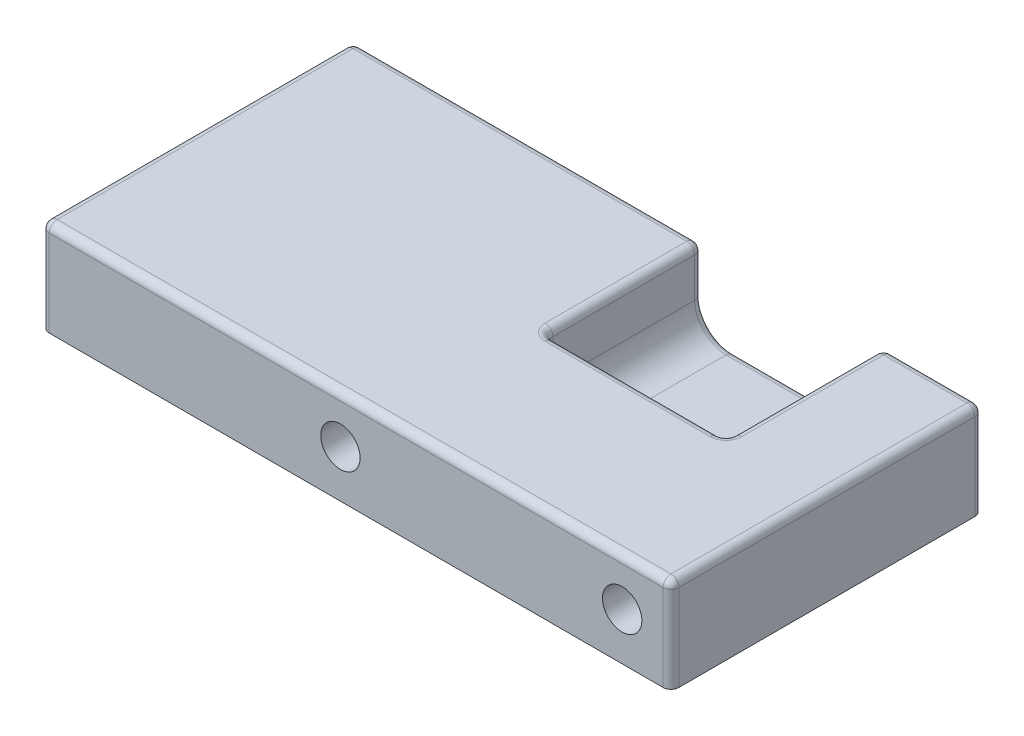
ISO-10303-21;
HEADER;
FILE_DESCRIPTION(('STEP AP214'),'2;1');
FILE_NAME('part.step','',(''),(''),'','','');
FILE_SCHEMA(('AUTOMOTIVE_DESIGN { 1 0 10303 214 1 1 1 1 }'));
ENDSEC;
DATA;
#1=APPLICATION_CONTEXT('core data for automotive mechanical design processes');
#2=APPLICATION_PROTOCOL_DEFINITION('international standard','automotive_design',2000,#1);
#3=PRODUCT_CONTEXT('',#1,'mechanical');
#4=PRODUCT('Part','Part','',(#3));
#5=PRODUCT_RELATED_PRODUCT_CATEGORY('part','',(#4));
#6=PRODUCT_DEFINITION_FORMATION('','',#4);
#7=PRODUCT_DEFINITION_CONTEXT('part definition',#1,'design');
#8=PRODUCT_DEFINITION('design','',#6,#7);
#9=PRODUCT_DEFINITION_SHAPE('','',#8);
#10=(LENGTH_UNIT() NAMED_UNIT(*) SI_UNIT(.MILLI.,.METRE.));
#11=(NAMED_UNIT(*) PLANE_ANGLE_UNIT() SI_UNIT($,.RADIAN.));
#12=(NAMED_UNIT(*) SI_UNIT($,.STERADIAN.) SOLID_ANGLE_UNIT());
#13=UNCERTAINTY_MEASURE_WITH_UNIT(LENGTH_MEASURE(1.E-05),#10,'distance_accuracy_value','');
#14=(GEOMETRIC_REPRESENTATION_CONTEXT(3) GLOBAL_UNCERTAINTY_ASSIGNED_CONTEXT((#13)) GLOBAL_UNIT_ASSIGNED_CONTEXT((#10,
#11,#12)) REPRESENTATION_CONTEXT('',''));
#15=CARTESIAN_POINT('',(0.,0.,0.));
#16=DIRECTION('',(0.,0.,1.));
#17=DIRECTION('',(1.,0.,0.));
#18=AXIS2_PLACEMENT_3D('',#15,#16,#17);
#19=CARTESIAN_POINT('',(0.,12.,0.));
#20=DIRECTION('',(1.,0.,0.));
#21=DIRECTION('',(0.,0.,-1.));
#22=AXIS2_PLACEMENT_3D('',#19,#20,#21);
#23=PLANE('',#22);
#24=DIRECTION('',(0.,0.,1.));
#25=VECTOR('',#24,1.);
#26=CARTESIAN_POINT('',(0.,0.,0.));
#27=LINE('',#26,#25);
#28=CARTESIAN_POINT('',(0.,0.,-38.6));
#29=VERTEX_POINT('',#28);
#30=CARTESIAN_POINT('',(0.,0.,-1.));
#31=VERTEX_POINT('',#30);
#32=EDGE_CURVE('E436',#29,#31,#27,.T.);
#33=ORIENTED_EDGE('',*,*,#32,.T.);
#34=DIRECTION('',(0.,-1.,0.));
#35=VECTOR('',#34,1.);
#36=CARTESIAN_POINT('',(0.,12.,-1.));
#37=LINE('',#36,#35);
#38=CARTESIAN_POINT('',(0.,11.,-1.));
#39=VERTEX_POINT('',#38);
#40=EDGE_CURVE('E11',#31,#39,#37,.F.);
#41=ORIENTED_EDGE('',*,*,#40,.T.);
#42=DIRECTION('',(0.,0.,1.));
#43=VECTOR('',#42,1.);
#44=CARTESIAN_POINT('',(0.,11.,0.));
#45=LINE('',#44,#43);
#46=CARTESIAN_POINT('',(0.,11.,-38.6));
#47=VERTEX_POINT('',#46);
#48=EDGE_CURVE('E48',#39,#47,#45,.F.);
#49=ORIENTED_EDGE('',*,*,#48,.T.);
#50=DIRECTION('',(0.,-1.,0.));
#51=VECTOR('',#50,1.);
#52=CARTESIAN_POINT('',(0.,12.,-38.6));
#53=LINE('',#52,#51);
#54=EDGE_CURVE('E41',#47,#29,#53,.T.);
#55=ORIENTED_EDGE('',*,*,#54,.T.);
#56=EDGE_LOOP('',(#33,#41,#49,#55));
#57=FACE_BOUND('',#56,.T.);
#58=ADVANCED_FACE('F32',(#57),#23,.F.);
#59=CARTESIAN_POINT('',(0.,12.,0.));
#60=DIRECTION('',(0.,0.,-1.));
#61=DIRECTION('',(-1.,0.,0.));
#62=AXIS2_PLACEMENT_3D('',#59,#60,#61);
#63=PLANE('',#62);
#64=DIRECTION('',(1.,0.,0.));
#65=VECTOR('',#64,1.);
#66=CARTESIAN_POINT('',(0.,0.,0.));
#67=LINE('',#66,#65);
#68=CARTESIAN_POINT('',(1.,0.,0.));
#69=VERTEX_POINT('',#68);
#70=CARTESIAN_POINT('',(79.,0.,0.));
#71=VERTEX_POINT('',#70);
#72=EDGE_CURVE('E438',#69,#71,#67,.T.);
#73=ORIENTED_EDGE('',*,*,#72,.T.);
#74=DIRECTION('',(0.,-1.,0.));
#75=VECTOR('',#74,1.);
#76=CARTESIAN_POINT('',(79.,12.,0.));
#77=LINE('',#76,#75);
#78=CARTESIAN_POINT('',(79.,11.,0.));
#79=VERTEX_POINT('',#78);
#80=EDGE_CURVE('E328',#71,#79,#77,.F.);
#81=ORIENTED_EDGE('',*,*,#80,.T.);
#82=DIRECTION('',(1.,0.,0.));
#83=VECTOR('',#82,1.);
#84=CARTESIAN_POINT('',(0.,11.,0.));
#85=LINE('',#84,#83);
#86=CARTESIAN_POINT('',(1.,11.,0.));
#87=VERTEX_POINT('',#86);
#88=EDGE_CURVE('E324',#79,#87,#85,.F.);
#89=ORIENTED_EDGE('',*,*,#88,.T.);
#90=DIRECTION('',(0.,-1.,0.));
#91=VECTOR('',#90,1.);
#92=CARTESIAN_POINT('',(1.,12.,0.));
#93=LINE('',#92,#91);
#94=EDGE_CURVE('E326',#87,#69,#93,.T.);
#95=ORIENTED_EDGE('',*,*,#94,.T.);
#96=EDGE_LOOP('',(#73,#81,#89,#95));
#97=FACE_BOUND('',#96,.T.);
#98=CARTESIAN_POINT('',(73.8,6.,0.));
#99=DIRECTION('',(0.,0.,-1.));
#100=DIRECTION('',(-1.,0.,0.));
#101=AXIS2_PLACEMENT_3D('',#98,#99,#100);
#102=CIRCLE('',#101,2.5);
#103=CARTESIAN_POINT('',(71.3,6.,0.));
#104=VERTEX_POINT('',#103);
#105=EDGE_CURVE('E427',#104,#104,#102,.F.);
#106=ORIENTED_EDGE('',*,*,#105,.F.);
#107=EDGE_LOOP('',(#106));
#108=FACE_BOUND('',#107,.T.);
#109=CARTESIAN_POINT('',(38.,6.,0.));
#110=DIRECTION('',(0.,0.,-1.));
#111=DIRECTION('',(-1.,0.,0.));
#112=AXIS2_PLACEMENT_3D('',#109,#110,#111);
#113=CIRCLE('',#112,2.5);
#114=CARTESIAN_POINT('',(35.5,6.,0.));
#115=VERTEX_POINT('',#114);
#116=EDGE_CURVE('E433',#115,#115,#113,.F.);
#117=ORIENTED_EDGE('',*,*,#116,.F.);
#118=EDGE_LOOP('',(#117));
#119=FACE_BOUND('',#118,.T.);
#120=ADVANCED_FACE('F526',(#97,#108,#119),#63,.F.);
#121=CARTESIAN_POINT('',(80.,12.,0.));
#122=DIRECTION('',(-1.,0.,0.));
#123=DIRECTION('',(0.,0.,1.));
#124=AXIS2_PLACEMENT_3D('',#121,#122,#123);
#125=PLANE('',#124);
#126=DIRECTION('',(0.,0.,-1.));
#127=VECTOR('',#126,1.);
#128=CARTESIAN_POINT('',(80.,0.,0.));
#129=LINE('',#128,#127);
#130=CARTESIAN_POINT('',(80.,0.,-1.));
#131=VERTEX_POINT('',#130);
#132=CARTESIAN_POINT('',(80.,0.,-38.6));
#133=VERTEX_POINT('',#132);
#134=EDGE_CURVE('E441',#131,#133,#129,.T.);
#135=ORIENTED_EDGE('',*,*,#134,.T.);
#136=DIRECTION('',(0.,-1.,0.));
#137=VECTOR('',#136,1.);
#138=CARTESIAN_POINT('',(80.,12.,-38.6));
#139=LINE('',#138,#137);
#140=CARTESIAN_POINT('',(80.,11.,-38.6));
#141=VERTEX_POINT('',#140);
#142=EDGE_CURVE('E322',#133,#141,#139,.F.);
#143=ORIENTED_EDGE('',*,*,#142,.T.);
#144=DIRECTION('',(0.,0.,-1.));
#145=VECTOR('',#144,1.);
#146=CARTESIAN_POINT('',(80.,11.,0.));
#147=LINE('',#146,#145);
#148=CARTESIAN_POINT('',(80.,11.,-1.));
#149=VERTEX_POINT('',#148);
#150=EDGE_CURVE('E318',#141,#149,#147,.F.);
#151=ORIENTED_EDGE('',*,*,#150,.T.);
#152=DIRECTION('',(0.,-1.,0.));
#153=VECTOR('',#152,1.);
#154=CARTESIAN_POINT('',(80.,12.,-1.));
#155=LINE('',#154,#153);
#156=EDGE_CURVE('E320',#149,#131,#155,.T.);
#157=ORIENTED_EDGE('',*,*,#156,.T.);
#158=EDGE_LOOP('',(#135,#143,#151,#157));
#159=FACE_BOUND('',#158,.T.);
#160=ADVANCED_FACE('F511',(#159),#125,.F.);
#161=CARTESIAN_POINT('',(0.,12.,-39.6));
#162=DIRECTION('',(0.,0.,1.));
#163=DIRECTION('',(1.,0.,0.));
#164=AXIS2_PLACEMENT_3D('',#161,#162,#163);
#165=PLANE('',#164);
#166=DIRECTION('',(-1.,0.,0.));
#167=VECTOR('',#166,1.);
#168=CARTESIAN_POINT('',(0.,0.,-39.6));
#169=LINE('',#168,#167);
#170=CARTESIAN_POINT('',(79.,0.,-39.6));
#171=VERTEX_POINT('',#170);
#172=CARTESIAN_POINT('',(1.,0.,-39.6));
#173=VERTEX_POINT('',#172);
#174=EDGE_CURVE('E444',#171,#173,#169,.T.);
#175=ORIENTED_EDGE('',*,*,#174,.T.);
#176=DIRECTION('',(0.,-1.,0.));
#177=VECTOR('',#176,1.);
#178=CARTESIAN_POINT('',(1.,12.,-39.6));
#179=LINE('',#178,#177);
#180=CARTESIAN_POINT('',(1.,11.,-39.6));
#181=VERTEX_POINT('',#180);
#182=EDGE_CURVE('E302',#173,#181,#179,.F.);
#183=ORIENTED_EDGE('',*,*,#182,.T.);
#184=DIRECTION('',(-1.,0.,0.));
#185=VECTOR('',#184,1.);
#186=CARTESIAN_POINT('',(0.,11.,-39.6));
#187=LINE('',#186,#185);
#188=CARTESIAN_POINT('',(43.4,11.,-39.6));
#189=VERTEX_POINT('',#188);
#190=EDGE_CURVE('E300',#181,#189,#187,.F.);
#191=ORIENTED_EDGE('',*,*,#190,.T.);
#192=DIRECTION('',(0.,1.,0.));
#193=VECTOR('',#192,1.);
#194=CARTESIAN_POINT('',(43.4,12.,-39.6));
#195=LINE('',#194,#193);
#196=CARTESIAN_POINT('',(43.4,6.,-39.6));
#197=VERTEX_POINT('',#196);
#198=EDGE_CURVE('E298',#189,#197,#195,.F.);
#199=ORIENTED_EDGE('',*,*,#198,.T.);
#200=CARTESIAN_POINT('',(48.4,6.,-39.6));
#201=DIRECTION('',(0.,0.,1.));
#202=DIRECTION('',(1.,0.,0.));
#203=AXIS2_PLACEMENT_3D('',#200,#201,#202);
#204=CIRCLE('',#203,5.00000000000001);
#205=CARTESIAN_POINT('',(48.4,0.999999999999996,-39.6));
#206=VERTEX_POINT('',#205);
#207=EDGE_CURVE('E296',#197,#206,#204,.T.);
#208=ORIENTED_EDGE('',*,*,#207,.T.);
#209=DIRECTION('',(-1.,0.,0.));
#210=VECTOR('',#209,1.);
#211=CARTESIAN_POINT('',(0.,1.,-39.6));
#212=LINE('',#211,#210);
#213=CARTESIAN_POINT('',(63.4,0.999999999999995,-39.6));
#214=VERTEX_POINT('',#213);
#215=EDGE_CURVE('E294',#206,#214,#212,.F.);
#216=ORIENTED_EDGE('',*,*,#215,.T.);
#217=CARTESIAN_POINT('',(63.4,6.,-39.6));
#218=DIRECTION('',(0.,0.,1.));
#219=DIRECTION('',(1.,0.,0.));
#220=AXIS2_PLACEMENT_3D('',#217,#218,#219);
#221=CIRCLE('',#220,5.00000000000001);
#222=CARTESIAN_POINT('',(68.4,6.,-39.6));
#223=VERTEX_POINT('',#222);
#224=EDGE_CURVE('E292',#214,#223,#221,.T.);
#225=ORIENTED_EDGE('',*,*,#224,.T.);
#226=DIRECTION('',(0.,-1.,0.));
#227=VECTOR('',#226,1.);
#228=CARTESIAN_POINT('',(68.4,12.,-39.6));
#229=LINE('',#228,#227);
#230=CARTESIAN_POINT('',(68.4,11.,-39.6));
#231=VERTEX_POINT('',#230);
#232=EDGE_CURVE('E289',#223,#231,#229,.F.);
#233=ORIENTED_EDGE('',*,*,#232,.T.);
#234=DIRECTION('',(-1.,0.,0.));
#235=VECTOR('',#234,1.);
#236=CARTESIAN_POINT('',(0.,11.,-39.6));
#237=LINE('',#236,#235);
#238=CARTESIAN_POINT('',(79.,11.,-39.6));
#239=VERTEX_POINT('',#238);
#240=EDGE_CURVE('E285',#231,#239,#237,.F.);
#241=ORIENTED_EDGE('',*,*,#240,.T.);
#242=DIRECTION('',(0.,-1.,0.));
#243=VECTOR('',#242,1.);
#244=CARTESIAN_POINT('',(79.,12.,-39.6));
#245=LINE('',#244,#243);
#246=EDGE_CURVE('E287',#239,#171,#245,.T.);
#247=ORIENTED_EDGE('',*,*,#246,.T.);
#248=EDGE_LOOP('',(#175,#183,#191,#199,#208,#216,#225,#233,#241,#247));
#249=FACE_BOUND('',#248,.T.);
#250=CARTESIAN_POINT('',(73.8,6.,-39.6));
#251=DIRECTION('',(0.,0.,-1.));
#252=DIRECTION('',(-1.,0.,0.));
#253=AXIS2_PLACEMENT_3D('',#250,#251,#252);
#254=CIRCLE('',#253,2.5);
#255=CARTESIAN_POINT('',(71.3,6.,-39.6));
#256=VERTEX_POINT('',#255);
#257=EDGE_CURVE('E221',#256,#256,#254,.T.);
#258=ORIENTED_EDGE('',*,*,#257,.F.);
#259=EDGE_LOOP('',(#258));
#260=FACE_BOUND('',#259,.T.);
#261=CARTESIAN_POINT('',(38.,6.,-39.6));
#262=DIRECTION('',(0.,0.,-1.));
#263=DIRECTION('',(-1.,0.,0.));
#264=AXIS2_PLACEMENT_3D('',#261,#262,#263);
#265=CIRCLE('',#264,2.5);
#266=CARTESIAN_POINT('',(35.5,6.,-39.6));
#267=VERTEX_POINT('',#266);
#268=EDGE_CURVE('E430',#267,#267,#265,.T.);
#269=ORIENTED_EDGE('',*,*,#268,.F.);
#270=EDGE_LOOP('',(#269));
#271=FACE_BOUND('',#270,.T.);
#272=ADVANCED_FACE('F449',(#249,#260,#271),#165,.F.);
#273=CARTESIAN_POINT('',(0.,12.,0.));
#274=DIRECTION('',(0.,-1.,0.));
#275=DIRECTION('',(0.,0.,-1.));
#276=AXIS2_PLACEMENT_3D('',#273,#274,#275);
#277=PLANE('',#276);
#278=DIRECTION('',(0.,0.,1.));
#279=VECTOR('',#278,1.);
#280=CARTESIAN_POINT('',(1.,12.,0.));
#281=LINE('',#280,#279);
#282=CARTESIAN_POINT('',(1.,12.,-38.6));
#283=VERTEX_POINT('',#282);
#284=CARTESIAN_POINT('',(1.,12.,-1.));
#285=VERTEX_POINT('',#284);
#286=EDGE_CURVE('E260',#283,#285,#281,.T.);
#287=ORIENTED_EDGE('',*,*,#286,.T.);
#288=DIRECTION('',(1.,0.,0.));
#289=VECTOR('',#288,1.);
#290=CARTESIAN_POINT('',(0.,12.,-1.));
#291=LINE('',#290,#289);
#292=CARTESIAN_POINT('',(79.,12.,-1.));
#293=VERTEX_POINT('',#292);
#294=EDGE_CURVE('E264',#285,#293,#291,.T.);
#295=ORIENTED_EDGE('',*,*,#294,.T.);
#296=DIRECTION('',(0.,0.,-1.));
#297=VECTOR('',#296,1.);
#298=CARTESIAN_POINT('',(79.,12.,0.));
#299=LINE('',#298,#297);
#300=CARTESIAN_POINT('',(79.,12.,-38.6));
#301=VERTEX_POINT('',#300);
#302=EDGE_CURVE('E262',#293,#301,#299,.T.);
#303=ORIENTED_EDGE('',*,*,#302,.T.);
#304=DIRECTION('',(-1.,0.,0.));
#305=VECTOR('',#304,1.);
#306=CARTESIAN_POINT('',(0.,12.,-38.6));
#307=LINE('',#306,#305);
#308=CARTESIAN_POINT('',(68.4,12.,-38.6));
#309=VERTEX_POINT('',#308);
#310=EDGE_CURVE('E256',#301,#309,#307,.T.);
#311=ORIENTED_EDGE('',*,*,#310,.T.);
#312=DIRECTION('',(0.,0.,-1.));
#313=VECTOR('',#312,1.);
#314=CARTESIAN_POINT('',(68.4,12.,0.));
#315=LINE('',#314,#313);
#316=CARTESIAN_POINT('',(68.4,12.,-20.6));
#317=VERTEX_POINT('',#316);
#318=EDGE_CURVE('E253',#309,#317,#315,.F.);
#319=ORIENTED_EDGE('',*,*,#318,.T.);
#320=CARTESIAN_POINT('',(66.4,12.,-20.6));
#321=DIRECTION('',(0.,-1.,0.));
#322=DIRECTION('',(0.,0.,-1.));
#323=AXIS2_PLACEMENT_3D('',#320,#321,#322);
#324=CIRCLE('',#323,2.);
#325=CARTESIAN_POINT('',(66.4,12.,-18.6));
#326=VERTEX_POINT('',#325);
#327=EDGE_CURVE('E250',#326,#317,#324,.F.);
#328=ORIENTED_EDGE('',*,*,#327,.F.);
#329=DIRECTION('',(1.,0.,0.));
#330=VECTOR('',#329,1.);
#331=CARTESIAN_POINT('',(44.4,12.,-18.6));
#332=LINE('',#331,#330);
#333=CARTESIAN_POINT('',(45.4,12.,-18.6));
#334=VERTEX_POINT('',#333);
#335=EDGE_CURVE('E242',#326,#334,#332,.F.);
#336=ORIENTED_EDGE('',*,*,#335,.T.);
#337=CARTESIAN_POINT('',(45.4,12.,-20.6));
#338=DIRECTION('',(0.,-1.,0.));
#339=DIRECTION('',(0.,0.,-1.));
#340=AXIS2_PLACEMENT_3D('',#337,#338,#339);
#341=CIRCLE('',#340,2.);
#342=CARTESIAN_POINT('',(43.4,12.,-20.6));
#343=VERTEX_POINT('',#342);
#344=EDGE_CURVE('E238',#343,#334,#341,.F.);
#345=ORIENTED_EDGE('',*,*,#344,.F.);
#346=DIRECTION('',(0.,0.,-1.));
#347=VECTOR('',#346,1.);
#348=CARTESIAN_POINT('',(43.4,12.,0.));
#349=LINE('',#348,#347);
#350=CARTESIAN_POINT('',(43.4,12.,-38.6));
#351=VERTEX_POINT('',#350);
#352=EDGE_CURVE('E248',#343,#351,#349,.T.);
#353=ORIENTED_EDGE('',*,*,#352,.T.);
#354=DIRECTION('',(-1.,0.,0.));
#355=VECTOR('',#354,1.);
#356=CARTESIAN_POINT('',(0.,12.,-38.6));
#357=LINE('',#356,#355);
#358=EDGE_CURVE('E258',#351,#283,#357,.T.);
#359=ORIENTED_EDGE('',*,*,#358,.T.);
#360=EDGE_LOOP('',(#287,#295,#303,#311,#319,#328,#336,#345,#353,#359));
#361=FACE_BOUND('',#360,.T.);
#362=ADVANCED_FACE('F501',(#361),#277,.F.);
#363=CARTESIAN_POINT('',(0.,0.,0.));
#364=DIRECTION('',(0.,-1.,0.));
#365=DIRECTION('',(0.,0.,-1.));
#366=AXIS2_PLACEMENT_3D('',#363,#364,#365);
#367=PLANE('',#366);
#368=ORIENTED_EDGE('',*,*,#174,.F.);
#369=CARTESIAN_POINT('',(79.,0.,-38.6));
#370=DIRECTION('',(0.,-1.,0.));
#371=DIRECTION('',(0.,0.,-1.));
#372=AXIS2_PLACEMENT_3D('',#369,#370,#371);
#373=CIRCLE('',#372,1.);
#374=EDGE_CURVE('E316',#171,#133,#373,.T.);
#375=ORIENTED_EDGE('',*,*,#374,.T.);
#376=ORIENTED_EDGE('',*,*,#134,.F.);
#377=CARTESIAN_POINT('',(79.,0.,-1.));
#378=DIRECTION('',(0.,-1.,0.));
#379=DIRECTION('',(0.,0.,-1.));
#380=AXIS2_PLACEMENT_3D('',#377,#378,#379);
#381=CIRCLE('',#380,1.);
#382=EDGE_CURVE('E314',#131,#71,#381,.T.);
#383=ORIENTED_EDGE('',*,*,#382,.T.);
#384=ORIENTED_EDGE('',*,*,#72,.F.);
#385=CARTESIAN_POINT('',(1.,0.,-1.));
#386=DIRECTION('',(0.,-1.,0.));
#387=DIRECTION('',(0.,0.,-1.));
#388=AXIS2_PLACEMENT_3D('',#385,#386,#387);
#389=CIRCLE('',#388,1.);
#390=EDGE_CURVE('E312',#69,#31,#389,.T.);
#391=ORIENTED_EDGE('',*,*,#390,.T.);
#392=ORIENTED_EDGE('',*,*,#32,.F.);
#393=CARTESIAN_POINT('',(1.,0.,-38.6));
#394=DIRECTION('',(0.,-1.,0.));
#395=DIRECTION('',(0.,0.,-1.));
#396=AXIS2_PLACEMENT_3D('',#393,#394,#395);
#397=CIRCLE('',#396,1.);
#398=EDGE_CURVE('E310',#29,#173,#397,.T.);
#399=ORIENTED_EDGE('',*,*,#398,.T.);
#400=EDGE_LOOP('',(#368,#375,#376,#383,#384,#391,#392,#399));
#401=FACE_BOUND('',#400,.T.);
#402=ADVANCED_FACE('F604',(#401),#367,.T.);
#403=CARTESIAN_POINT('',(38.,6.,0.001000000000001));
#404=DIRECTION('',(0.,0.,-1.));
#405=DIRECTION('',(-1.,0.,0.));
#406=AXIS2_PLACEMENT_3D('',#403,#404,#405);
#407=CYLINDRICAL_SURFACE('',#406,2.5);
#408=ORIENTED_EDGE('',*,*,#268,.T.);
#409=EDGE_LOOP('',(#408));
#410=FACE_BOUND('',#409,.T.);
#411=ORIENTED_EDGE('',*,*,#116,.T.);
#412=EDGE_LOOP('',(#411));
#413=FACE_BOUND('',#412,.T.);
#414=ADVANCED_FACE('F607',(#410,#413),#407,.F.);
#415=CARTESIAN_POINT('',(73.8,6.,0.001000000000001));
#416=DIRECTION('',(0.,0.,-1.));
#417=DIRECTION('',(-1.,0.,0.));
#418=AXIS2_PLACEMENT_3D('',#415,#416,#417);
#419=CYLINDRICAL_SURFACE('',#418,2.5);
#420=ORIENTED_EDGE('',*,*,#257,.T.);
#421=EDGE_LOOP('',(#420));
#422=FACE_BOUND('',#421,.T.);
#423=ORIENTED_EDGE('',*,*,#105,.T.);
#424=EDGE_LOOP('',(#423));
#425=FACE_BOUND('',#424,.T.);
#426=ADVANCED_FACE('F612',(#422,#425),#419,.F.);
#427=CARTESIAN_POINT('',(63.4,6.,-19.6));
#428=DIRECTION('',(0.,0.,-1.));
#429=DIRECTION('',(-1.,0.,0.));
#430=AXIS2_PLACEMENT_3D('',#427,#428,#429);
#431=CYLINDRICAL_SURFACE('',#430,4.00000000000001);
#432=DIRECTION('',(0.,0.,-1.));
#433=VECTOR('',#432,1.);
#434=CARTESIAN_POINT('',(63.4,1.99999999999999,-19.6));
#435=LINE('',#434,#433);
#436=CARTESIAN_POINT('',(63.4,1.99999999999999,-20.6));
#437=VERTEX_POINT('',#436);
#438=CARTESIAN_POINT('',(63.4,1.99999999999999,-38.6));
#439=VERTEX_POINT('',#438);
#440=EDGE_CURVE('E205',#437,#439,#435,.T.);
#441=ORIENTED_EDGE('',*,*,#440,.F.);
#442=CARTESIAN_POINT('',(63.4,6.,-20.6));
#443=DIRECTION('',(0.,0.,-1.));
#444=DIRECTION('',(-1.,0.,0.));
#445=AXIS2_PLACEMENT_3D('',#442,#443,#444);
#446=CIRCLE('',#445,4.00000000000001);
#447=CARTESIAN_POINT('',(67.4,6.,-20.6));
#448=VERTEX_POINT('',#447);
#449=EDGE_CURVE('E199',#437,#448,#446,.F.);
#450=ORIENTED_EDGE('',*,*,#449,.T.);
#451=DIRECTION('',(0.,0.,-1.));
#452=VECTOR('',#451,1.);
#453=CARTESIAN_POINT('',(67.4,6.,-19.6));
#454=LINE('',#453,#452);
#455=CARTESIAN_POINT('',(67.4,6.,-38.6));
#456=VERTEX_POINT('',#455);
#457=EDGE_CURVE('E202',#448,#456,#454,.T.);
#458=ORIENTED_EDGE('',*,*,#457,.T.);
#459=CARTESIAN_POINT('',(63.4,6.,-38.6));
#460=DIRECTION('',(0.,0.,1.));
#461=DIRECTION('',(1.,0.,0.));
#462=AXIS2_PLACEMENT_3D('',#459,#460,#461);
#463=CIRCLE('',#462,4.00000000000001);
#464=EDGE_CURVE('E211',#456,#439,#463,.F.);
#465=ORIENTED_EDGE('',*,*,#464,.T.);
#466=EDGE_LOOP('',(#441,#450,#458,#465));
#467=FACE_BOUND('',#466,.T.);
#468=ADVANCED_FACE('F201',(#467),#431,.F.);
#469=CARTESIAN_POINT('',(67.4,6.,-19.6));
#470=DIRECTION('',(1.,0.,0.));
#471=DIRECTION('',(0.,0.,-1.));
#472=AXIS2_PLACEMENT_3D('',#469,#470,#471);
#473=PLANE('',#472);
#474=ORIENTED_EDGE('',*,*,#457,.F.);
#475=DIRECTION('',(0.,-1.,0.));
#476=VECTOR('',#475,1.);
#477=CARTESIAN_POINT('',(67.4,6.,-20.6));
#478=LINE('',#477,#476);
#479=CARTESIAN_POINT('',(67.4,11.,-20.6));
#480=VERTEX_POINT('',#479);
#481=EDGE_CURVE('E217',#448,#480,#478,.F.);
#482=ORIENTED_EDGE('',*,*,#481,.T.);
#483=DIRECTION('',(0.,0.,-1.));
#484=VECTOR('',#483,1.);
#485=CARTESIAN_POINT('',(67.4,11.,-19.6));
#486=LINE('',#485,#484);
#487=CARTESIAN_POINT('',(67.4,11.,-38.6));
#488=VERTEX_POINT('',#487);
#489=EDGE_CURVE('E239',#480,#488,#486,.T.);
#490=ORIENTED_EDGE('',*,*,#489,.T.);
#491=DIRECTION('',(0.,-1.,0.));
#492=VECTOR('',#491,1.);
#493=CARTESIAN_POINT('',(67.4,6.,-38.6));
#494=LINE('',#493,#492);
#495=EDGE_CURVE('E220',#488,#456,#494,.T.);
#496=ORIENTED_EDGE('',*,*,#495,.T.);
#497=EDGE_LOOP('',(#474,#482,#490,#496));
#498=FACE_BOUND('',#497,.T.);
#499=ADVANCED_FACE('F214',(#498),#473,.F.);
#500=CARTESIAN_POINT('',(44.4,6.,-19.6));
#501=DIRECTION('',(-1.,0.,0.));
#502=DIRECTION('',(0.,-1.,0.));
#503=AXIS2_PLACEMENT_3D('',#500,#501,#502);
#504=PLANE('',#503);
#505=DIRECTION('',(0.,0.,-1.));
#506=VECTOR('',#505,1.);
#507=CARTESIAN_POINT('',(44.4,11.,-19.6));
#508=LINE('',#507,#506);
#509=CARTESIAN_POINT('',(44.4,11.,-38.6));
#510=VERTEX_POINT('',#509);
#511=CARTESIAN_POINT('',(44.4,11.,-20.6));
#512=VERTEX_POINT('',#511);
#513=EDGE_CURVE('E306',#510,#512,#508,.F.);
#514=ORIENTED_EDGE('',*,*,#513,.T.);
#515=DIRECTION('',(0.,1.,0.));
#516=VECTOR('',#515,1.);
#517=CARTESIAN_POINT('',(44.4,6.,-20.6));
#518=LINE('',#517,#516);
#519=CARTESIAN_POINT('',(44.4,6.,-20.6));
#520=VERTEX_POINT('',#519);
#521=EDGE_CURVE('E308',#512,#520,#518,.F.);
#522=ORIENTED_EDGE('',*,*,#521,.T.);
#523=DIRECTION('',(0.,0.,-1.));
#524=VECTOR('',#523,1.);
#525=CARTESIAN_POINT('',(44.4,6.,-19.6));
#526=LINE('',#525,#524);
#527=CARTESIAN_POINT('',(44.4,6.,-38.6));
#528=VERTEX_POINT('',#527);
#529=EDGE_CURVE('E222',#520,#528,#526,.T.);
#530=ORIENTED_EDGE('',*,*,#529,.T.);
#531=DIRECTION('',(0.,1.,0.));
#532=VECTOR('',#531,1.);
#533=CARTESIAN_POINT('',(44.4,6.,-38.6));
#534=LINE('',#533,#532);
#535=EDGE_CURVE('E304',#528,#510,#534,.T.);
#536=ORIENTED_EDGE('',*,*,#535,.T.);
#537=EDGE_LOOP('',(#514,#522,#530,#536));
#538=FACE_BOUND('',#537,.T.);
#539=ADVANCED_FACE('F548',(#538),#504,.F.);
#540=CARTESIAN_POINT('',(48.4,6.,-19.6));
#541=DIRECTION('',(0.,0.,-1.));
#542=DIRECTION('',(-1.,0.,0.));
#543=AXIS2_PLACEMENT_3D('',#540,#541,#542);
#544=CYLINDRICAL_SURFACE('',#543,4.00000000000001);
#545=ORIENTED_EDGE('',*,*,#529,.F.);
#546=CARTESIAN_POINT('',(48.4,6.,-20.6));
#547=DIRECTION('',(0.,0.,-1.));
#548=DIRECTION('',(-1.,0.,0.));
#549=AXIS2_PLACEMENT_3D('',#546,#547,#548);
#550=CIRCLE('',#549,4.00000000000001);
#551=CARTESIAN_POINT('',(48.4,2.,-20.6));
#552=VERTEX_POINT('',#551);
#553=EDGE_CURVE('E283',#520,#552,#550,.F.);
#554=ORIENTED_EDGE('',*,*,#553,.T.);
#555=DIRECTION('',(0.,0.,-1.));
#556=VECTOR('',#555,1.);
#557=CARTESIAN_POINT('',(48.4,2.,-19.6));
#558=LINE('',#557,#556);
#559=CARTESIAN_POINT('',(48.4,2.,-38.6));
#560=VERTEX_POINT('',#559);
#561=EDGE_CURVE('E417',#552,#560,#558,.T.);
#562=ORIENTED_EDGE('',*,*,#561,.T.);
#563=CARTESIAN_POINT('',(48.4,6.,-38.6));
#564=DIRECTION('',(0.,0.,1.));
#565=DIRECTION('',(1.,0.,0.));
#566=AXIS2_PLACEMENT_3D('',#563,#564,#565);
#567=CIRCLE('',#566,4.00000000000001);
#568=EDGE_CURVE('E281',#560,#528,#567,.F.);
#569=ORIENTED_EDGE('',*,*,#568,.T.);
#570=EDGE_LOOP('',(#545,#554,#562,#569));
#571=FACE_BOUND('',#570,.T.);
#572=ADVANCED_FACE('F565',(#571),#544,.F.);
#573=CARTESIAN_POINT('',(63.4,1.99999999999999,-19.6));
#574=DIRECTION('',(0.,-1.,0.));
#575=DIRECTION('',(1.,0.,0.));
#576=AXIS2_PLACEMENT_3D('',#573,#574,#575);
#577=PLANE('',#576);
#578=ORIENTED_EDGE('',*,*,#561,.F.);
#579=DIRECTION('',(-1.,0.,0.));
#580=VECTOR('',#579,1.);
#581=CARTESIAN_POINT('',(63.4,1.99999999999999,-20.6));
#582=LINE('',#581,#580);
#583=EDGE_CURVE('E279',#552,#437,#582,.F.);
#584=ORIENTED_EDGE('',*,*,#583,.T.);
#585=ORIENTED_EDGE('',*,*,#440,.T.);
#586=DIRECTION('',(-1.,0.,0.));
#587=VECTOR('',#586,1.);
#588=CARTESIAN_POINT('',(63.4,1.99999999999999,-38.6));
#589=LINE('',#588,#587);
#590=EDGE_CURVE('E210',#439,#560,#589,.T.);
#591=ORIENTED_EDGE('',*,*,#590,.T.);
#592=EDGE_LOOP('',(#578,#584,#585,#591));
#593=FACE_BOUND('',#592,.T.);
#594=ADVANCED_FACE('F566',(#593),#577,.F.);
#595=CARTESIAN_POINT('',(63.4,6.,-19.6));
#596=DIRECTION('',(0.,0.,-1.));
#597=DIRECTION('',(-1.,0.,0.));
#598=AXIS2_PLACEMENT_3D('',#595,#596,#597);
#599=PLANE('',#598);
#600=DIRECTION('',(1.,0.,0.));
#601=VECTOR('',#600,1.);
#602=CARTESIAN_POINT('',(67.4,11.,-19.6));
#603=LINE('',#602,#601);
#604=CARTESIAN_POINT('',(45.4,11.,-19.6));
#605=VERTEX_POINT('',#604);
#606=CARTESIAN_POINT('',(66.4,11.,-19.6));
#607=VERTEX_POINT('',#606);
#608=EDGE_CURVE('E266',#605,#607,#603,.T.);
#609=ORIENTED_EDGE('',*,*,#608,.T.);
#610=DIRECTION('',(0.,-1.,0.));
#611=VECTOR('',#610,1.);
#612=CARTESIAN_POINT('',(66.4,6.,-19.6));
#613=LINE('',#612,#611);
#614=CARTESIAN_POINT('',(66.4,6.,-19.6));
#615=VERTEX_POINT('',#614);
#616=EDGE_CURVE('E275',#607,#615,#613,.T.);
#617=ORIENTED_EDGE('',*,*,#616,.T.);
#618=CARTESIAN_POINT('',(63.4,6.,-19.6));
#619=DIRECTION('',(0.,0.,-1.));
#620=DIRECTION('',(-1.,0.,0.));
#621=AXIS2_PLACEMENT_3D('',#618,#619,#620);
#622=CIRCLE('',#621,3.00000000000001);
#623=CARTESIAN_POINT('',(63.4,2.99999999999999,-19.6));
#624=VERTEX_POINT('',#623);
#625=EDGE_CURVE('E227',#615,#624,#622,.T.);
#626=ORIENTED_EDGE('',*,*,#625,.T.);
#627=DIRECTION('',(-1.,0.,0.));
#628=VECTOR('',#627,1.);
#629=CARTESIAN_POINT('',(63.4,2.99999999999999,-19.6));
#630=LINE('',#629,#628);
#631=CARTESIAN_POINT('',(48.4,3.,-19.6));
#632=VERTEX_POINT('',#631);
#633=EDGE_CURVE('E272',#624,#632,#630,.T.);
#634=ORIENTED_EDGE('',*,*,#633,.T.);
#635=CARTESIAN_POINT('',(48.4,6.,-19.6));
#636=DIRECTION('',(0.,0.,-1.));
#637=DIRECTION('',(-1.,0.,0.));
#638=AXIS2_PLACEMENT_3D('',#635,#636,#637);
#639=CIRCLE('',#638,3.00000000000001);
#640=CARTESIAN_POINT('',(45.4,6.,-19.6));
#641=VERTEX_POINT('',#640);
#642=EDGE_CURVE('E270',#632,#641,#639,.T.);
#643=ORIENTED_EDGE('',*,*,#642,.T.);
#644=DIRECTION('',(0.,1.,0.));
#645=VECTOR('',#644,1.);
#646=CARTESIAN_POINT('',(45.4,6.00000000000002,-19.6));
#647=LINE('',#646,#645);
#648=EDGE_CURVE('E268',#641,#605,#647,.T.);
#649=ORIENTED_EDGE('',*,*,#648,.T.);
#650=EDGE_LOOP('',(#609,#617,#626,#634,#643,#649));
#651=FACE_BOUND('',#650,.T.);
#652=ADVANCED_FACE('F571',(#651),#599,.T.);
#653=CARTESIAN_POINT('',(1.,12.,-38.6));
#654=DIRECTION('',(0.,-1.,0.));
#655=DIRECTION('',(0.,0.,-1.));
#656=AXIS2_PLACEMENT_3D('',#653,#654,#655);
#657=CYLINDRICAL_SURFACE('',#656,1.);
#658=ORIENTED_EDGE('',*,*,#398,.F.);
#659=ORIENTED_EDGE('',*,*,#54,.F.);
#660=CARTESIAN_POINT('',(1.,11.,-38.6));
#661=DIRECTION('',(0.,1.,0.));
#662=DIRECTION('',(0.,0.,1.));
#663=AXIS2_PLACEMENT_3D('',#660,#661,#662);
#664=CIRCLE('',#663,1.);
#665=EDGE_CURVE('E410',#181,#47,#664,.T.);
#666=ORIENTED_EDGE('',*,*,#665,.F.);
#667=ORIENTED_EDGE('',*,*,#182,.F.);
#668=EDGE_LOOP('',(#658,#659,#666,#667));
#669=FACE_BOUND('',#668,.T.);
#670=ADVANCED_FACE('F34',(#669),#657,.T.);
#671=CARTESIAN_POINT('',(1.,12.,-1.));
#672=DIRECTION('',(0.,-1.,0.));
#673=DIRECTION('',(0.,0.,-1.));
#674=AXIS2_PLACEMENT_3D('',#671,#672,#673);
#675=CYLINDRICAL_SURFACE('',#674,1.);
#676=ORIENTED_EDGE('',*,*,#390,.F.);
#677=ORIENTED_EDGE('',*,*,#94,.F.);
#678=CARTESIAN_POINT('',(1.,11.,-1.));
#679=DIRECTION('',(0.,1.,0.));
#680=DIRECTION('',(0.,0.,1.));
#681=AXIS2_PLACEMENT_3D('',#678,#679,#680);
#682=CIRCLE('',#681,1.);
#683=EDGE_CURVE('E408',#39,#87,#682,.T.);
#684=ORIENTED_EDGE('',*,*,#683,.F.);
#685=ORIENTED_EDGE('',*,*,#40,.F.);
#686=EDGE_LOOP('',(#676,#677,#684,#685));
#687=FACE_BOUND('',#686,.T.);
#688=ADVANCED_FACE('F532',(#687),#675,.T.);
#689=CARTESIAN_POINT('',(1.,11.,0.));
#690=DIRECTION('',(0.,0.,1.));
#691=DIRECTION('',(1.,0.,0.));
#692=AXIS2_PLACEMENT_3D('',#689,#690,#691);
#693=CYLINDRICAL_SURFACE('',#692,1.);
#694=CARTESIAN_POINT('',(1.,11.,-38.6));
#695=DIRECTION('',(0.,0.,-1.));
#696=DIRECTION('',(-1.,0.,0.));
#697=AXIS2_PLACEMENT_3D('',#694,#695,#696);
#698=CIRCLE('',#697,1.);
#699=EDGE_CURVE('E36',#47,#283,#698,.T.);
#700=ORIENTED_EDGE('',*,*,#699,.F.);
#701=ORIENTED_EDGE('',*,*,#48,.F.);
#702=CARTESIAN_POINT('',(1.,11.,-1.));
#703=DIRECTION('',(0.,0.,1.));
#704=DIRECTION('',(1.,0.,0.));
#705=AXIS2_PLACEMENT_3D('',#702,#703,#704);
#706=CIRCLE('',#705,1.);
#707=EDGE_CURVE('E405',#285,#39,#706,.T.);
#708=ORIENTED_EDGE('',*,*,#707,.F.);
#709=ORIENTED_EDGE('',*,*,#286,.F.);
#710=EDGE_LOOP('',(#700,#701,#708,#709));
#711=FACE_BOUND('',#710,.T.);
#712=ADVANCED_FACE('F538',(#711),#693,.T.);
#713=CARTESIAN_POINT('',(1.,11.,-38.6));
#714=DIRECTION('',(0.,0.,1.));
#715=DIRECTION('',(1.,0.,0.));
#716=AXIS2_PLACEMENT_3D('',#713,#714,#715);
#717=SPHERICAL_SURFACE('',#716,1.);
#718=ORIENTED_EDGE('',*,*,#665,.T.);
#719=ORIENTED_EDGE('',*,*,#699,.T.);
#720=CARTESIAN_POINT('',(1.,11.,-38.6));
#721=DIRECTION('',(-1.,0.,0.));
#722=DIRECTION('',(0.,0.,1.));
#723=AXIS2_PLACEMENT_3D('',#720,#721,#722);
#724=CIRCLE('',#723,1.);
#725=EDGE_CURVE('E402',#181,#283,#724,.F.);
#726=ORIENTED_EDGE('',*,*,#725,.F.);
#727=EDGE_LOOP('',(#718,#719,#726));
#728=FACE_BOUND('',#727,.T.);
#729=ADVANCED_FACE('F457',(#728),#717,.T.);
#730=CARTESIAN_POINT('',(1.,11.,-1.));
#731=DIRECTION('',(0.,0.,1.));
#732=DIRECTION('',(1.,0.,0.));
#733=AXIS2_PLACEMENT_3D('',#730,#731,#732);
#734=SPHERICAL_SURFACE('',#733,1.);
#735=ORIENTED_EDGE('',*,*,#707,.T.);
#736=ORIENTED_EDGE('',*,*,#683,.T.);
#737=CARTESIAN_POINT('',(1.,11.,-1.));
#738=DIRECTION('',(-1.,0.,0.));
#739=DIRECTION('',(0.,0.,1.));
#740=AXIS2_PLACEMENT_3D('',#737,#738,#739);
#741=CIRCLE('',#740,1.);
#742=EDGE_CURVE('E399',#285,#87,#741,.F.);
#743=ORIENTED_EDGE('',*,*,#742,.F.);
#744=EDGE_LOOP('',(#735,#736,#743));
#745=FACE_BOUND('',#744,.T.);
#746=ADVANCED_FACE('F534',(#745),#734,.T.);
#747=CARTESIAN_POINT('',(0.,11.,-38.6));
#748=DIRECTION('',(-1.,0.,0.));
#749=DIRECTION('',(0.,0.,1.));
#750=AXIS2_PLACEMENT_3D('',#747,#748,#749);
#751=CYLINDRICAL_SURFACE('',#750,1.);
#752=ORIENTED_EDGE('',*,*,#725,.T.);
#753=ORIENTED_EDGE('',*,*,#358,.F.);
#754=CARTESIAN_POINT('',(43.4,11.,-38.6));
#755=DIRECTION('',(1.,0.,0.));
#756=DIRECTION('',(0.,0.,-1.));
#757=AXIS2_PLACEMENT_3D('',#754,#755,#756);
#758=CIRCLE('',#757,1.);
#759=EDGE_CURVE('E396',#189,#351,#758,.T.);
#760=ORIENTED_EDGE('',*,*,#759,.F.);
#761=ORIENTED_EDGE('',*,*,#190,.F.);
#762=EDGE_LOOP('',(#752,#753,#760,#761));
#763=FACE_BOUND('',#762,.T.);
#764=ADVANCED_FACE('F461',(#763),#751,.T.);
#765=CARTESIAN_POINT('',(43.4,6.,-38.6));
#766=DIRECTION('',(0.,1.,0.));
#767=DIRECTION('',(-1.,0.,0.));
#768=AXIS2_PLACEMENT_3D('',#765,#766,#767);
#769=CYLINDRICAL_SURFACE('',#768,1.);
#770=CARTESIAN_POINT('',(43.4,6.,-38.6));
#771=DIRECTION('',(0.,-1.,0.));
#772=DIRECTION('',(0.,0.,-1.));
#773=AXIS2_PLACEMENT_3D('',#770,#771,#772);
#774=CIRCLE('',#773,1.);
#775=EDGE_CURVE('E390',#197,#528,#774,.T.);
#776=ORIENTED_EDGE('',*,*,#775,.F.);
#777=ORIENTED_EDGE('',*,*,#198,.F.);
#778=CARTESIAN_POINT('',(43.4,11.,-38.6));
#779=DIRECTION('',(0.,1.,0.));
#780=DIRECTION('',(-1.,0.,0.));
#781=AXIS2_PLACEMENT_3D('',#778,#779,#780);
#782=CIRCLE('',#781,1.);
#783=EDGE_CURVE('E393',#510,#189,#782,.T.);
#784=ORIENTED_EDGE('',*,*,#783,.F.);
#785=ORIENTED_EDGE('',*,*,#535,.F.);
#786=EDGE_LOOP('',(#776,#777,#784,#785));
#787=FACE_BOUND('',#786,.T.);
#788=ADVANCED_FACE('F466',(#787),#769,.T.);
#789=CARTESIAN_POINT('',(79.,12.,-1.));
#790=DIRECTION('',(0.,-1.,0.));
#791=DIRECTION('',(0.,0.,-1.));
#792=AXIS2_PLACEMENT_3D('',#789,#790,#791);
#793=CYLINDRICAL_SURFACE('',#792,1.);
#794=ORIENTED_EDGE('',*,*,#382,.F.);
#795=ORIENTED_EDGE('',*,*,#156,.F.);
#796=CARTESIAN_POINT('',(79.,11.,-1.));
#797=DIRECTION('',(0.,1.,0.));
#798=DIRECTION('',(0.,0.,1.));
#799=AXIS2_PLACEMENT_3D('',#796,#797,#798);
#800=CIRCLE('',#799,1.);
#801=EDGE_CURVE('E387',#79,#149,#800,.T.);
#802=ORIENTED_EDGE('',*,*,#801,.F.);
#803=ORIENTED_EDGE('',*,*,#80,.F.);
#804=EDGE_LOOP('',(#794,#795,#802,#803));
#805=FACE_BOUND('',#804,.T.);
#806=ADVANCED_FACE('F516',(#805),#793,.T.);
#807=CARTESIAN_POINT('',(0.,11.,-1.));
#808=DIRECTION('',(1.,0.,0.));
#809=DIRECTION('',(0.,0.,-1.));
#810=AXIS2_PLACEMENT_3D('',#807,#808,#809);
#811=CYLINDRICAL_SURFACE('',#810,1.);
#812=ORIENTED_EDGE('',*,*,#742,.T.);
#813=ORIENTED_EDGE('',*,*,#88,.F.);
#814=CARTESIAN_POINT('',(79.,11.,-1.));
#815=DIRECTION('',(1.,0.,0.));
#816=DIRECTION('',(0.,0.,-1.));
#817=AXIS2_PLACEMENT_3D('',#814,#815,#816);
#818=CIRCLE('',#817,1.);
#819=EDGE_CURVE('E384',#293,#79,#818,.T.);
#820=ORIENTED_EDGE('',*,*,#819,.F.);
#821=ORIENTED_EDGE('',*,*,#294,.F.);
#822=EDGE_LOOP('',(#812,#813,#820,#821));
#823=FACE_BOUND('',#822,.T.);
#824=ADVANCED_FACE('F522',(#823),#811,.T.);
#825=CARTESIAN_POINT('',(43.4,11.,-38.6));
#826=DIRECTION('',(0.,0.,1.));
#827=DIRECTION('',(1.,0.,0.));
#828=AXIS2_PLACEMENT_3D('',#825,#826,#827);
#829=SPHERICAL_SURFACE('',#828,1.);
#830=ORIENTED_EDGE('',*,*,#783,.T.);
#831=ORIENTED_EDGE('',*,*,#759,.T.);
#832=CARTESIAN_POINT('',(43.4,11.,-38.6));
#833=DIRECTION('',(0.,0.,-1.));
#834=DIRECTION('',(-1.,0.,0.));
#835=AXIS2_PLACEMENT_3D('',#832,#833,#834);
#836=CIRCLE('',#835,1.);
#837=EDGE_CURVE('E381',#510,#351,#836,.F.);
#838=ORIENTED_EDGE('',*,*,#837,.F.);
#839=EDGE_LOOP('',(#830,#831,#838));
#840=FACE_BOUND('',#839,.T.);
#841=ADVANCED_FACE('F541',(#840),#829,.T.);
#842=CARTESIAN_POINT('',(48.4,6.,-20.6));
#843=DIRECTION('',(0.,0.,-1.));
#844=DIRECTION('',(-1.,0.,0.));
#845=AXIS2_PLACEMENT_3D('',#842,#843,#844);
#846=TOROIDAL_SURFACE('',#845,3.00000000000001,1.);
#847=CARTESIAN_POINT('',(48.4,3.,-20.6));
#848=DIRECTION('',(-1.,0.,0.));
#849=DIRECTION('',(0.,0.,1.));
#850=AXIS2_PLACEMENT_3D('',#847,#848,#849);
#851=CIRCLE('',#850,1.);
#852=EDGE_CURVE('E375',#552,#632,#851,.T.);
#853=ORIENTED_EDGE('',*,*,#852,.F.);
#854=ORIENTED_EDGE('',*,*,#553,.F.);
#855=CARTESIAN_POINT('',(45.4,6.,-20.6));
#856=DIRECTION('',(0.,-1.,0.));
#857=DIRECTION('',(0.,0.,-1.));
#858=AXIS2_PLACEMENT_3D('',#855,#856,#857);
#859=CIRCLE('',#858,1.);
#860=EDGE_CURVE('E378',#641,#520,#859,.T.);
#861=ORIENTED_EDGE('',*,*,#860,.F.);
#862=ORIENTED_EDGE('',*,*,#642,.F.);
#863=EDGE_LOOP('',(#853,#854,#861,#862));
#864=FACE_BOUND('',#863,.T.);
#865=ADVANCED_FACE('F561',(#864),#846,.F.);
#866=CARTESIAN_POINT('',(48.4,6.,-38.6));
#867=DIRECTION('',(0.,0.,1.));
#868=DIRECTION('',(1.,0.,0.));
#869=AXIS2_PLACEMENT_3D('',#866,#867,#868);
#870=TOROIDAL_SURFACE('',#869,5.00000000000001,1.);
#871=ORIENTED_EDGE('',*,*,#775,.T.);
#872=ORIENTED_EDGE('',*,*,#568,.F.);
#873=CARTESIAN_POINT('',(48.4,0.999999999999997,-38.6));
#874=DIRECTION('',(1.,0.,0.));
#875=DIRECTION('',(0.,0.,-1.));
#876=AXIS2_PLACEMENT_3D('',#873,#874,#875);
#877=CIRCLE('',#876,1.);
#878=EDGE_CURVE('E372',#206,#560,#877,.T.);
#879=ORIENTED_EDGE('',*,*,#878,.F.);
#880=ORIENTED_EDGE('',*,*,#207,.F.);
#881=EDGE_LOOP('',(#871,#872,#879,#880));
#882=FACE_BOUND('',#881,.T.);
#883=ADVANCED_FACE('F473',(#882),#870,.T.);
#884=CARTESIAN_POINT('',(79.,11.,-1.));
#885=DIRECTION('',(0.,0.,1.));
#886=DIRECTION('',(1.,0.,0.));
#887=AXIS2_PLACEMENT_3D('',#884,#885,#886);
#888=SPHERICAL_SURFACE('',#887,1.);
#889=ORIENTED_EDGE('',*,*,#819,.T.);
#890=ORIENTED_EDGE('',*,*,#801,.T.);
#891=CARTESIAN_POINT('',(79.,11.,-1.));
#892=DIRECTION('',(0.,0.,1.));
#893=DIRECTION('',(1.,0.,0.));
#894=AXIS2_PLACEMENT_3D('',#891,#892,#893);
#895=CIRCLE('',#894,1.);
#896=EDGE_CURVE('E369',#293,#149,#895,.F.);
#897=ORIENTED_EDGE('',*,*,#896,.F.);
#898=EDGE_LOOP('',(#889,#890,#897));
#899=FACE_BOUND('',#898,.T.);
#900=ADVANCED_FACE('F519',(#899),#888,.T.);
#901=CARTESIAN_POINT('',(43.4,11.,0.));
#902=DIRECTION('',(0.,0.,-1.));
#903=DIRECTION('',(-1.,0.,0.));
#904=AXIS2_PLACEMENT_3D('',#901,#902,#903);
#905=CYLINDRICAL_SURFACE('',#904,1.);
#906=ORIENTED_EDGE('',*,*,#837,.T.);
#907=ORIENTED_EDGE('',*,*,#352,.F.);
#908=CARTESIAN_POINT('',(43.4,11.,-20.6));
#909=DIRECTION('',(0.,0.,1.));
#910=DIRECTION('',(1.,0.,0.));
#911=AXIS2_PLACEMENT_3D('',#908,#909,#910);
#912=CIRCLE('',#911,1.);
#913=EDGE_CURVE('E366',#512,#343,#912,.T.);
#914=ORIENTED_EDGE('',*,*,#913,.F.);
#915=ORIENTED_EDGE('',*,*,#513,.F.);
#916=EDGE_LOOP('',(#906,#907,#914,#915));
#917=FACE_BOUND('',#916,.T.);
#918=ADVANCED_FACE('F544',(#917),#905,.T.);
#919=CARTESIAN_POINT('',(45.4,6.00000000000002,-20.6));
#920=DIRECTION('',(0.,1.,0.));
#921=DIRECTION('',(-1.,0.,0.));
#922=AXIS2_PLACEMENT_3D('',#919,#920,#921);
#923=CYLINDRICAL_SURFACE('',#922,1.);
#924=ORIENTED_EDGE('',*,*,#860,.T.);
#925=ORIENTED_EDGE('',*,*,#521,.F.);
#926=CARTESIAN_POINT('',(45.4,11.,-20.6));
#927=DIRECTION('',(0.,-1.,0.));
#928=DIRECTION('',(0.,0.,-1.));
#929=AXIS2_PLACEMENT_3D('',#926,#927,#928);
#930=CIRCLE('',#929,1.);
#931=EDGE_CURVE('E363',#605,#512,#930,.T.);
#932=ORIENTED_EDGE('',*,*,#931,.F.);
#933=ORIENTED_EDGE('',*,*,#648,.F.);
#934=EDGE_LOOP('',(#924,#925,#932,#933));
#935=FACE_BOUND('',#934,.T.);
#936=ADVANCED_FACE('F553',(#935),#923,.F.);
#937=CARTESIAN_POINT('',(63.4,2.99999999999999,-20.6));
#938=DIRECTION('',(-1.,0.,0.));
#939=DIRECTION('',(0.,-1.,0.));
#940=AXIS2_PLACEMENT_3D('',#937,#938,#939);
#941=CYLINDRICAL_SURFACE('',#940,1.);
#942=ORIENTED_EDGE('',*,*,#852,.T.);
#943=ORIENTED_EDGE('',*,*,#633,.F.);
#944=CARTESIAN_POINT('',(63.4,2.99999999999999,-20.6));
#945=DIRECTION('',(-1.,0.,0.));
#946=DIRECTION('',(0.,0.,1.));
#947=AXIS2_PLACEMENT_3D('',#944,#945,#946);
#948=CIRCLE('',#947,1.);
#949=EDGE_CURVE('E361',#437,#624,#948,.T.);
#950=ORIENTED_EDGE('',*,*,#949,.F.);
#951=ORIENTED_EDGE('',*,*,#583,.F.);
#952=EDGE_LOOP('',(#942,#943,#950,#951));
#953=FACE_BOUND('',#952,.T.);
#954=ADVANCED_FACE('F568',(#953),#941,.F.);
#955=CARTESIAN_POINT('',(63.4,0.999999999999994,-38.6));
#956=DIRECTION('',(-1.,0.,0.));
#957=DIRECTION('',(0.,-1.,0.));
#958=AXIS2_PLACEMENT_3D('',#955,#956,#957);
#959=CYLINDRICAL_SURFACE('',#958,1.);
#960=ORIENTED_EDGE('',*,*,#878,.T.);
#961=ORIENTED_EDGE('',*,*,#590,.F.);
#962=CARTESIAN_POINT('',(63.4,0.999999999999994,-38.6));
#963=DIRECTION('',(1.,0.,0.));
#964=DIRECTION('',(0.,0.,-1.));
#965=AXIS2_PLACEMENT_3D('',#962,#963,#964);
#966=CIRCLE('',#965,1.);
#967=EDGE_CURVE('E358',#214,#439,#966,.T.);
#968=ORIENTED_EDGE('',*,*,#967,.F.);
#969=ORIENTED_EDGE('',*,*,#215,.F.);
#970=EDGE_LOOP('',(#960,#961,#968,#969));
#971=FACE_BOUND('',#970,.T.);
#972=ADVANCED_FACE('F479',(#971),#959,.T.);
#973=CARTESIAN_POINT('',(79.,12.,-38.6));
#974=DIRECTION('',(0.,-1.,0.));
#975=DIRECTION('',(0.,0.,-1.));
#976=AXIS2_PLACEMENT_3D('',#973,#974,#975);
#977=CYLINDRICAL_SURFACE('',#976,1.);
#978=ORIENTED_EDGE('',*,*,#374,.F.);
#979=ORIENTED_EDGE('',*,*,#246,.F.);
#980=CARTESIAN_POINT('',(79.,11.,-38.6));
#981=DIRECTION('',(0.,1.,0.));
#982=DIRECTION('',(0.,0.,1.));
#983=AXIS2_PLACEMENT_3D('',#980,#981,#982);
#984=CIRCLE('',#983,1.);
#985=EDGE_CURVE('E355',#141,#239,#984,.T.);
#986=ORIENTED_EDGE('',*,*,#985,.F.);
#987=ORIENTED_EDGE('',*,*,#142,.F.);
#988=EDGE_LOOP('',(#978,#979,#986,#987));
#989=FACE_BOUND('',#988,.T.);
#990=ADVANCED_FACE('F491',(#989),#977,.T.);
#991=CARTESIAN_POINT('',(79.,11.,0.));
#992=DIRECTION('',(0.,0.,-1.));
#993=DIRECTION('',(-1.,0.,0.));
#994=AXIS2_PLACEMENT_3D('',#991,#992,#993);
#995=CYLINDRICAL_SURFACE('',#994,1.);
#996=ORIENTED_EDGE('',*,*,#896,.T.);
#997=ORIENTED_EDGE('',*,*,#150,.F.);
#998=CARTESIAN_POINT('',(79.,11.,-38.6));
#999=DIRECTION('',(0.,0.,-1.));
#1000=DIRECTION('',(-1.,0.,0.));
#1001=AXIS2_PLACEMENT_3D('',#998,#999,#1000);
#1002=CIRCLE('',#1001,1.);
#1003=EDGE_CURVE('E352',#301,#141,#1002,.T.);
#1004=ORIENTED_EDGE('',*,*,#1003,.F.);
#1005=ORIENTED_EDGE('',*,*,#302,.F.);
#1006=EDGE_LOOP('',(#996,#997,#1004,#1005));
#1007=FACE_BOUND('',#1006,.T.);
#1008=ADVANCED_FACE('F507',(#1007),#995,.T.);
#1009=CARTESIAN_POINT('',(45.4,11.,-20.6));
#1010=DIRECTION('',(0.,-1.,0.));
#1011=DIRECTION('',(0.,0.,-1.));
#1012=AXIS2_PLACEMENT_3D('',#1009,#1010,#1011);
#1013=TOROIDAL_SURFACE('',#1012,2.,1.);
#1014=ORIENTED_EDGE('',*,*,#913,.T.);
#1015=ORIENTED_EDGE('',*,*,#344,.T.);
#1016=CARTESIAN_POINT('',(45.4,11.,-18.6));
#1017=DIRECTION('',(-1.,0.,0.));
#1018=DIRECTION('',(0.,0.,1.));
#1019=AXIS2_PLACEMENT_3D('',#1016,#1017,#1018);
#1020=CIRCLE('',#1019,1.);
#1021=EDGE_CURVE('E231',#605,#334,#1020,.F.);
#1022=ORIENTED_EDGE('',*,*,#1021,.F.);
#1023=ORIENTED_EDGE('',*,*,#931,.T.);
#1024=EDGE_LOOP('',(#1014,#1015,#1022,#1023));
#1025=FACE_BOUND('',#1024,.T.);
#1026=ADVANCED_FACE('F671',(#1025),#1013,.T.);
#1027=CARTESIAN_POINT('',(63.4,6.,-20.6));
#1028=DIRECTION('',(0.,0.,-1.));
#1029=DIRECTION('',(-1.,0.,0.));
#1030=AXIS2_PLACEMENT_3D('',#1027,#1028,#1029);
#1031=TOROIDAL_SURFACE('',#1030,3.00000000000001,1.);
#1032=ORIENTED_EDGE('',*,*,#949,.T.);
#1033=ORIENTED_EDGE('',*,*,#625,.F.);
#1034=CARTESIAN_POINT('',(66.4,6.,-20.6));
#1035=DIRECTION('',(0.,-1.,0.));
#1036=DIRECTION('',(0.,0.,-1.));
#1037=AXIS2_PLACEMENT_3D('',#1034,#1035,#1036);
#1038=CIRCLE('',#1037,1.);
#1039=EDGE_CURVE('E225',#448,#615,#1038,.T.);
#1040=ORIENTED_EDGE('',*,*,#1039,.F.);
#1041=ORIENTED_EDGE('',*,*,#449,.F.);
#1042=EDGE_LOOP('',(#1032,#1033,#1040,#1041));
#1043=FACE_BOUND('',#1042,.T.);
#1044=ADVANCED_FACE('F226',(#1043),#1031,.F.);
#1045=CARTESIAN_POINT('',(63.4,6.,-38.6));
#1046=DIRECTION('',(0.,0.,1.));
#1047=DIRECTION('',(1.,0.,0.));
#1048=AXIS2_PLACEMENT_3D('',#1045,#1046,#1047);
#1049=TOROIDAL_SURFACE('',#1048,5.00000000000001,1.);
#1050=ORIENTED_EDGE('',*,*,#967,.T.);
#1051=ORIENTED_EDGE('',*,*,#464,.F.);
#1052=CARTESIAN_POINT('',(68.4,6.,-38.6));
#1053=DIRECTION('',(0.,1.,0.));
#1054=DIRECTION('',(0.,0.,1.));
#1055=AXIS2_PLACEMENT_3D('',#1052,#1053,#1054);
#1056=CIRCLE('',#1055,1.);
#1057=EDGE_CURVE('E232',#223,#456,#1056,.T.);
#1058=ORIENTED_EDGE('',*,*,#1057,.F.);
#1059=ORIENTED_EDGE('',*,*,#224,.F.);
#1060=EDGE_LOOP('',(#1050,#1051,#1058,#1059));
#1061=FACE_BOUND('',#1060,.T.);
#1062=ADVANCED_FACE('F481',(#1061),#1049,.T.);
#1063=CARTESIAN_POINT('',(79.,11.,-38.6));
#1064=DIRECTION('',(0.,0.,1.));
#1065=DIRECTION('',(1.,0.,0.));
#1066=AXIS2_PLACEMENT_3D('',#1063,#1064,#1065);
#1067=SPHERICAL_SURFACE('',#1066,1.);
#1068=ORIENTED_EDGE('',*,*,#1003,.T.);
#1069=ORIENTED_EDGE('',*,*,#985,.T.);
#1070=CARTESIAN_POINT('',(79.,11.,-38.6));
#1071=DIRECTION('',(1.,0.,0.));
#1072=DIRECTION('',(0.,0.,-1.));
#1073=AXIS2_PLACEMENT_3D('',#1070,#1071,#1072);
#1074=CIRCLE('',#1073,1.);
#1075=EDGE_CURVE('E345',#301,#239,#1074,.F.);
#1076=ORIENTED_EDGE('',*,*,#1075,.F.);
#1077=EDGE_LOOP('',(#1068,#1069,#1076));
#1078=FACE_BOUND('',#1077,.T.);
#1079=ADVANCED_FACE('F495',(#1078),#1067,.T.);
#1080=CARTESIAN_POINT('',(63.4,11.,-18.6));
#1081=DIRECTION('',(-1.,0.,0.));
#1082=DIRECTION('',(0.,0.,1.));
#1083=AXIS2_PLACEMENT_3D('',#1080,#1081,#1082);
#1084=CYLINDRICAL_SURFACE('',#1083,1.);
#1085=ORIENTED_EDGE('',*,*,#1021,.T.);
#1086=ORIENTED_EDGE('',*,*,#335,.F.);
#1087=CARTESIAN_POINT('',(66.4,11.,-18.6));
#1088=DIRECTION('',(1.,0.,0.));
#1089=DIRECTION('',(0.,0.,-1.));
#1090=AXIS2_PLACEMENT_3D('',#1087,#1088,#1089);
#1091=CIRCLE('',#1090,1.);
#1092=EDGE_CURVE('E342',#607,#326,#1091,.T.);
#1093=ORIENTED_EDGE('',*,*,#1092,.F.);
#1094=ORIENTED_EDGE('',*,*,#608,.F.);
#1095=EDGE_LOOP('',(#1085,#1086,#1093,#1094));
#1096=FACE_BOUND('',#1095,.T.);
#1097=ADVANCED_FACE('F576',(#1096),#1084,.T.);
#1098=CARTESIAN_POINT('',(66.4,6.,-20.6));
#1099=DIRECTION('',(0.,-1.,0.));
#1100=DIRECTION('',(0.,0.,-1.));
#1101=AXIS2_PLACEMENT_3D('',#1098,#1099,#1100);
#1102=CYLINDRICAL_SURFACE('',#1101,1.);
#1103=ORIENTED_EDGE('',*,*,#1039,.T.);
#1104=ORIENTED_EDGE('',*,*,#616,.F.);
#1105=CARTESIAN_POINT('',(66.4,11.,-20.6));
#1106=DIRECTION('',(0.,-1.,0.));
#1107=DIRECTION('',(0.,0.,-1.));
#1108=AXIS2_PLACEMENT_3D('',#1105,#1106,#1107);
#1109=CIRCLE('',#1108,1.);
#1110=EDGE_CURVE('E236',#480,#607,#1109,.T.);
#1111=ORIENTED_EDGE('',*,*,#1110,.F.);
#1112=ORIENTED_EDGE('',*,*,#481,.F.);
#1113=EDGE_LOOP('',(#1103,#1104,#1111,#1112));
#1114=FACE_BOUND('',#1113,.T.);
#1115=ADVANCED_FACE('F234',(#1114),#1102,.F.);
#1116=CARTESIAN_POINT('',(68.4,6.,-38.6));
#1117=DIRECTION('',(0.,-1.,0.));
#1118=DIRECTION('',(0.,0.,-1.));
#1119=AXIS2_PLACEMENT_3D('',#1116,#1117,#1118);
#1120=CYLINDRICAL_SURFACE('',#1119,1.);
#1121=ORIENTED_EDGE('',*,*,#1057,.T.);
#1122=ORIENTED_EDGE('',*,*,#495,.F.);
#1123=CARTESIAN_POINT('',(68.4,11.,-38.6));
#1124=DIRECTION('',(0.,1.,0.));
#1125=DIRECTION('',(0.,0.,1.));
#1126=AXIS2_PLACEMENT_3D('',#1123,#1124,#1125);
#1127=CIRCLE('',#1126,1.);
#1128=EDGE_CURVE('E338',#231,#488,#1127,.T.);
#1129=ORIENTED_EDGE('',*,*,#1128,.F.);
#1130=ORIENTED_EDGE('',*,*,#232,.F.);
#1131=EDGE_LOOP('',(#1121,#1122,#1129,#1130));
#1132=FACE_BOUND('',#1131,.T.);
#1133=ADVANCED_FACE('F485',(#1132),#1120,.T.);
#1134=CARTESIAN_POINT('',(0.,11.,-38.6));
#1135=DIRECTION('',(-1.,0.,0.));
#1136=DIRECTION('',(0.,0.,1.));
#1137=AXIS2_PLACEMENT_3D('',#1134,#1135,#1136);
#1138=CYLINDRICAL_SURFACE('',#1137,1.);
#1139=ORIENTED_EDGE('',*,*,#1075,.T.);
#1140=ORIENTED_EDGE('',*,*,#240,.F.);
#1141=CARTESIAN_POINT('',(68.4,11.,-38.6));
#1142=DIRECTION('',(-1.,0.,0.));
#1143=DIRECTION('',(0.,0.,1.));
#1144=AXIS2_PLACEMENT_3D('',#1141,#1142,#1143);
#1145=CIRCLE('',#1144,1.);
#1146=EDGE_CURVE('E336',#309,#231,#1145,.T.);
#1147=ORIENTED_EDGE('',*,*,#1146,.F.);
#1148=ORIENTED_EDGE('',*,*,#310,.F.);
#1149=EDGE_LOOP('',(#1139,#1140,#1147,#1148));
#1150=FACE_BOUND('',#1149,.T.);
#1151=ADVANCED_FACE('F498',(#1150),#1138,.T.);
#1152=CARTESIAN_POINT('',(66.4,11.,-20.6));
#1153=DIRECTION('',(0.,-1.,0.));
#1154=DIRECTION('',(0.,0.,-1.));
#1155=AXIS2_PLACEMENT_3D('',#1152,#1153,#1154);
#1156=TOROIDAL_SURFACE('',#1155,2.,1.);
#1157=ORIENTED_EDGE('',*,*,#1092,.T.);
#1158=ORIENTED_EDGE('',*,*,#327,.T.);
#1159=CARTESIAN_POINT('',(68.4,11.,-20.6));
#1160=DIRECTION('',(0.,0.,1.));
#1161=DIRECTION('',(1.,0.,0.));
#1162=AXIS2_PLACEMENT_3D('',#1159,#1160,#1161);
#1163=CIRCLE('',#1162,1.);
#1164=EDGE_CURVE('E334',#480,#317,#1163,.F.);
#1165=ORIENTED_EDGE('',*,*,#1164,.F.);
#1166=ORIENTED_EDGE('',*,*,#1110,.T.);
#1167=EDGE_LOOP('',(#1157,#1158,#1165,#1166));
#1168=FACE_BOUND('',#1167,.T.);
#1169=ADVANCED_FACE('F578',(#1168),#1156,.T.);
#1170=CARTESIAN_POINT('',(68.4,11.,-38.6));
#1171=DIRECTION('',(0.,0.,1.));
#1172=DIRECTION('',(1.,0.,0.));
#1173=AXIS2_PLACEMENT_3D('',#1170,#1171,#1172);
#1174=SPHERICAL_SURFACE('',#1173,1.);
#1175=ORIENTED_EDGE('',*,*,#1146,.T.);
#1176=ORIENTED_EDGE('',*,*,#1128,.T.);
#1177=CARTESIAN_POINT('',(68.4,11.,-38.6));
#1178=DIRECTION('',(0.,0.,-1.));
#1179=DIRECTION('',(-1.,0.,0.));
#1180=AXIS2_PLACEMENT_3D('',#1177,#1178,#1179);
#1181=CIRCLE('',#1180,1.);
#1182=EDGE_CURVE('E332',#309,#488,#1181,.F.);
#1183=ORIENTED_EDGE('',*,*,#1182,.F.);
#1184=EDGE_LOOP('',(#1175,#1176,#1183));
#1185=FACE_BOUND('',#1184,.T.);
#1186=ADVANCED_FACE('F584',(#1185),#1174,.T.);
#1187=CARTESIAN_POINT('',(68.4,11.,-19.6));
#1188=DIRECTION('',(0.,0.,-1.));
#1189=DIRECTION('',(-1.,0.,0.));
#1190=AXIS2_PLACEMENT_3D('',#1187,#1188,#1189);
#1191=CYLINDRICAL_SURFACE('',#1190,1.);
#1192=ORIENTED_EDGE('',*,*,#1164,.T.);
#1193=ORIENTED_EDGE('',*,*,#318,.F.);
#1194=ORIENTED_EDGE('',*,*,#1182,.T.);
#1195=ORIENTED_EDGE('',*,*,#489,.F.);
#1196=EDGE_LOOP('',(#1192,#1193,#1194,#1195));
#1197=FACE_BOUND('',#1196,.T.);
#1198=ADVANCED_FACE('F581',(#1197),#1191,.T.);
#1199=CLOSED_SHELL('',(#58,#120,#160,#272,#362,#402,#414,#426,#468,#499,#539,#572,#594,#652,
#670,#688,#712,#729,#746,#764,#788,#806,#824,#841,#865,#883,#900,#918,#936,#954,#972,#990,#1008,
#1026,#1044,#1062,#1079,#1097,#1115,#1133,#1151,#1169,#1186,#1198));
#1200=MANIFOLD_SOLID_BREP('B2',#1199);
#1201=ADVANCED_BREP_SHAPE_REPRESENTATION('',(#18,#1200),#14);
#1202=SHAPE_DEFINITION_REPRESENTATION(#9,#1201);
ENDSEC;
END-ISO-10303-21;
